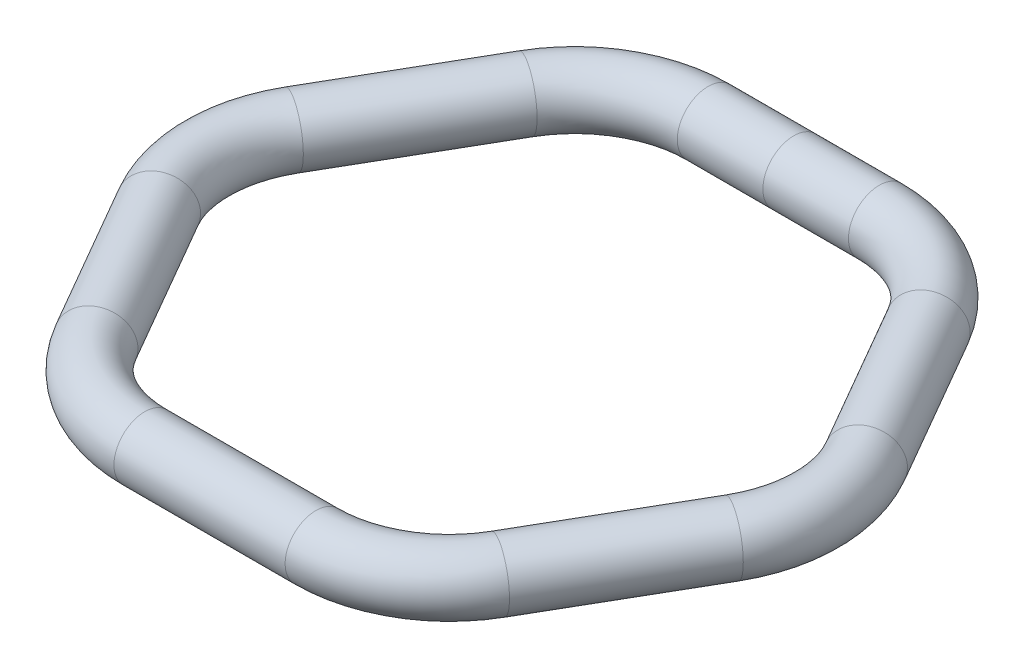
ISO-10303-21;
HEADER;
FILE_DESCRIPTION(('STEP AP214'),'2;1');
FILE_NAME('part.step','',(''),(''),'','','');
FILE_SCHEMA(('AUTOMOTIVE_DESIGN { 1 0 10303 214 1 1 1 1 }'));
ENDSEC;
DATA;
#1=APPLICATION_CONTEXT('core data for automotive mechanical design processes');
#2=APPLICATION_PROTOCOL_DEFINITION('international standard','automotive_design',2000,#1);
#3=PRODUCT_CONTEXT('',#1,'mechanical');
#4=PRODUCT('Part','Part','',(#3));
#5=PRODUCT_RELATED_PRODUCT_CATEGORY('part','',(#4));
#6=PRODUCT_DEFINITION_FORMATION('','',#4);
#7=PRODUCT_DEFINITION_CONTEXT('part definition',#1,'design');
#8=PRODUCT_DEFINITION('design','',#6,#7);
#9=PRODUCT_DEFINITION_SHAPE('','',#8);
#10=(LENGTH_UNIT() NAMED_UNIT(*) SI_UNIT(.MILLI.,.METRE.));
#11=(NAMED_UNIT(*) PLANE_ANGLE_UNIT() SI_UNIT($,.RADIAN.));
#12=(NAMED_UNIT(*) SI_UNIT($,.STERADIAN.) SOLID_ANGLE_UNIT());
#13=UNCERTAINTY_MEASURE_WITH_UNIT(LENGTH_MEASURE(1.E-05),#10,'distance_accuracy_value','');
#14=(GEOMETRIC_REPRESENTATION_CONTEXT(3) GLOBAL_UNCERTAINTY_ASSIGNED_CONTEXT((#13)) GLOBAL_UNIT_ASSIGNED_CONTEXT((#10,
#11,#12)) REPRESENTATION_CONTEXT('',''));
#15=CARTESIAN_POINT('',(0.,0.,0.));
#16=DIRECTION('',(0.,0.,1.));
#17=DIRECTION('',(1.,0.,0.));
#18=AXIS2_PLACEMENT_3D('',#15,#16,#17);
#19=CARTESIAN_POINT('',(-20.8423447177455,0.,-68.6));
#20=DIRECTION('',(1.,0.,0.));
#21=DIRECTION('',(0.,0.,-1.));
#22=AXIS2_PLACEMENT_3D('',#19,#20,#21);
#23=CYLINDRICAL_SURFACE('',#22,7.50000000000001);
#24=CARTESIAN_POINT('',(0.,0.,-68.6));
#25=DIRECTION('',(1.,0.,0.));
#26=DIRECTION('',(0.,0.,-1.));
#27=AXIS2_PLACEMENT_3D('',#24,#25,#26);
#28=CIRCLE('',#27,7.50000000000001);
#29=CARTESIAN_POINT('',(0.,0.,-76.1));
#30=VERTEX_POINT('',#29);
#31=EDGE_CURVE('E73',#30,#30,#28,.T.);
#32=ORIENTED_EDGE('',*,*,#31,.F.);
#33=EDGE_LOOP('',(#32));
#34=FACE_BOUND('',#33,.T.);
#35=CARTESIAN_POINT('',(-20.8423447177455,0.,-68.6));
#36=DIRECTION('',(1.,0.,0.));
#37=DIRECTION('',(0.,0.,-1.));
#38=AXIS2_PLACEMENT_3D('',#35,#36,#37);
#39=CIRCLE('',#38,7.50000000000001);
#40=CARTESIAN_POINT('',(-20.8423447177455,0.,-76.1));
#41=VERTEX_POINT('',#40);
#42=EDGE_CURVE('E10',#41,#41,#39,.T.);
#43=ORIENTED_EDGE('',*,*,#42,.T.);
#44=EDGE_LOOP('',(#43));
#45=FACE_BOUND('',#44,.T.);
#46=ADVANCED_FACE('F30',(#34,#45),#23,.T.);
#47=CARTESIAN_POINT('',(-20.8423447177455,0.,-36.1));
#48=DIRECTION('',(0.,-1.,0.));
#49=DIRECTION('',(0.,0.,-1.));
#50=AXIS2_PLACEMENT_3D('',#47,#48,#49);
#51=TOROIDAL_SURFACE('',#50,32.5,7.50000000000001);
#52=CARTESIAN_POINT('',(-48.9881703407398,0.,-52.35));
#53=DIRECTION('',(0.5,0.,-0.866025403784439));
#54=DIRECTION('',(-0.866025403784439,0.,-0.5));
#55=AXIS2_PLACEMENT_3D('',#52,#53,#54);
#56=CIRCLE('',#55,7.50000000000001);
#57=CARTESIAN_POINT('',(-55.4833608691231,0.,-56.1));
#58=VERTEX_POINT('',#57);
#59=EDGE_CURVE('E36',#58,#58,#56,.T.);
#60=CARTESIAN_POINT('',(-20.8423447177455,0.,-36.1));
#61=DIRECTION('',(0.,-1.,0.));
#62=DIRECTION('',(0.,0.,-1.));
#63=AXIS2_PLACEMENT_3D('',#60,#61,#62);
#64=CIRCLE('',#63,40.);
#65=EDGE_CURVE('',#58,#41,#64,.T.);
#66=ORIENTED_EDGE('',*,*,#59,.T.);
#67=ORIENTED_EDGE('',*,*,#42,.F.);
#68=ORIENTED_EDGE('',*,*,#65,.T.);
#69=ORIENTED_EDGE('',*,*,#65,.F.);
#70=EDGE_LOOP('',(#66,#68,#67,#69));
#71=FACE_BOUND('',#70,.T.);
#72=ADVANCED_FACE('F80',(#71),#51,.T.);
#73=CARTESIAN_POINT('',(-69.8305150584852,0.,-16.25));
#74=DIRECTION('',(0.5,0.,-0.866025403784439));
#75=DIRECTION('',(-0.866025403784439,0.,-0.5));
#76=AXIS2_PLACEMENT_3D('',#73,#74,#75);
#77=CYLINDRICAL_SURFACE('',#76,7.50000000000001);
#78=ORIENTED_EDGE('',*,*,#59,.F.);
#79=EDGE_LOOP('',(#78));
#80=FACE_BOUND('',#79,.T.);
#81=CARTESIAN_POINT('',(-69.8305150584852,0.,-16.25));
#82=DIRECTION('',(0.499999999999999,0.,-0.866025403784439));
#83=DIRECTION('',(-0.866025403784439,0.,-0.499999999999999));
#84=AXIS2_PLACEMENT_3D('',#81,#82,#83);
#85=CIRCLE('',#84,7.50000000000001);
#86=CARTESIAN_POINT('',(-76.3257055868686,0.,-20.));
#87=VERTEX_POINT('',#86);
#88=EDGE_CURVE('E40',#87,#87,#85,.T.);
#89=ORIENTED_EDGE('',*,*,#88,.T.);
#90=EDGE_LOOP('',(#89));
#91=FACE_BOUND('',#90,.T.);
#92=ADVANCED_FACE('F84',(#80,#91),#77,.T.);
#93=CARTESIAN_POINT('',(-41.684689435491,0.,0.));
#94=DIRECTION('',(0.,-1.,0.));
#95=DIRECTION('',(0.,0.,-1.));
#96=AXIS2_PLACEMENT_3D('',#93,#94,#95);
#97=TOROIDAL_SURFACE('',#96,32.5,7.50000000000001);
#98=CARTESIAN_POINT('',(-69.8305150584852,0.,16.25));
#99=DIRECTION('',(-0.5,0.,-0.866025403784439));
#100=DIRECTION('',(-0.866025403784439,0.,0.5));
#101=AXIS2_PLACEMENT_3D('',#98,#99,#100);
#102=CIRCLE('',#101,7.50000000000001);
#103=CARTESIAN_POINT('',(-76.3257055868686,0.,20.));
#104=VERTEX_POINT('',#103);
#105=EDGE_CURVE('E44',#104,#104,#102,.T.);
#106=CARTESIAN_POINT('',(-41.684689435491,0.,0.));
#107=DIRECTION('',(0.,-1.,0.));
#108=DIRECTION('',(0.,0.,-1.));
#109=AXIS2_PLACEMENT_3D('',#106,#107,#108);
#110=CIRCLE('',#109,40.);
#111=EDGE_CURVE('',#104,#87,#110,.T.);
#112=ORIENTED_EDGE('',*,*,#105,.T.);
#113=ORIENTED_EDGE('',*,*,#88,.F.);
#114=ORIENTED_EDGE('',*,*,#111,.T.);
#115=ORIENTED_EDGE('',*,*,#111,.F.);
#116=EDGE_LOOP('',(#112,#114,#113,#115));
#117=FACE_BOUND('',#116,.T.);
#118=ADVANCED_FACE('F89',(#117),#97,.T.);
#119=CARTESIAN_POINT('',(-48.9881703407397,0.,52.35));
#120=DIRECTION('',(-0.5,0.,-0.866025403784439));
#121=DIRECTION('',(-0.866025403784439,0.,0.5));
#122=AXIS2_PLACEMENT_3D('',#119,#120,#121);
#123=CYLINDRICAL_SURFACE('',#122,7.50000000000001);
#124=ORIENTED_EDGE('',*,*,#105,.F.);
#125=EDGE_LOOP('',(#124));
#126=FACE_BOUND('',#125,.T.);
#127=CARTESIAN_POINT('',(-48.9881703407397,0.,52.35));
#128=DIRECTION('',(-0.5,0.,-0.866025403784438));
#129=DIRECTION('',(-0.866025403784438,0.,0.5));
#130=AXIS2_PLACEMENT_3D('',#127,#128,#129);
#131=CIRCLE('',#130,7.50000000000001);
#132=CARTESIAN_POINT('',(-55.483360869123,0.,56.1));
#133=VERTEX_POINT('',#132);
#134=EDGE_CURVE('E49',#133,#133,#131,.T.);
#135=ORIENTED_EDGE('',*,*,#134,.T.);
#136=EDGE_LOOP('',(#135));
#137=FACE_BOUND('',#136,.T.);
#138=ADVANCED_FACE('F95',(#126,#137),#123,.T.);
#139=CARTESIAN_POINT('',(-20.8423447177455,0.,36.1));
#140=DIRECTION('',(0.,-1.,0.));
#141=DIRECTION('',(0.,0.,-1.));
#142=AXIS2_PLACEMENT_3D('',#139,#140,#141);
#143=TOROIDAL_SURFACE('',#142,32.5,7.50000000000001);
#144=CARTESIAN_POINT('',(-20.8423447177455,0.,68.6));
#145=DIRECTION('',(-1.,0.,0.));
#146=DIRECTION('',(0.,0.,1.));
#147=AXIS2_PLACEMENT_3D('',#144,#145,#146);
#148=CIRCLE('',#147,7.50000000000001);
#149=CARTESIAN_POINT('',(-20.8423447177455,0.,76.1));
#150=VERTEX_POINT('',#149);
#151=EDGE_CURVE('E52',#150,#150,#148,.T.);
#152=CARTESIAN_POINT('',(-20.8423447177455,0.,36.1));
#153=DIRECTION('',(0.,-1.,0.));
#154=DIRECTION('',(0.,0.,-1.));
#155=AXIS2_PLACEMENT_3D('',#152,#153,#154);
#156=CIRCLE('',#155,40.);
#157=EDGE_CURVE('',#150,#133,#156,.T.);
#158=ORIENTED_EDGE('',*,*,#151,.T.);
#159=ORIENTED_EDGE('',*,*,#134,.F.);
#160=ORIENTED_EDGE('',*,*,#157,.T.);
#161=ORIENTED_EDGE('',*,*,#157,.F.);
#162=EDGE_LOOP('',(#158,#160,#159,#161));
#163=FACE_BOUND('',#162,.T.);
#164=ADVANCED_FACE('F99',(#163),#143,.T.);
#165=CARTESIAN_POINT('',(20.8423447177455,0.,68.6));
#166=DIRECTION('',(-1.,0.,0.));
#167=DIRECTION('',(0.,0.,1.));
#168=AXIS2_PLACEMENT_3D('',#165,#166,#167);
#169=CYLINDRICAL_SURFACE('',#168,7.50000000000001);
#170=ORIENTED_EDGE('',*,*,#151,.F.);
#171=EDGE_LOOP('',(#170));
#172=FACE_BOUND('',#171,.T.);
#173=CARTESIAN_POINT('',(20.8423447177455,0.,68.6));
#174=DIRECTION('',(-1.,0.,0.));
#175=DIRECTION('',(0.,0.,1.));
#176=AXIS2_PLACEMENT_3D('',#173,#174,#175);
#177=CIRCLE('',#176,7.50000000000001);
#178=CARTESIAN_POINT('',(20.8423447177455,0.,76.1));
#179=VERTEX_POINT('',#178);
#180=EDGE_CURVE('E55',#179,#179,#177,.T.);
#181=ORIENTED_EDGE('',*,*,#180,.T.);
#182=EDGE_LOOP('',(#181));
#183=FACE_BOUND('',#182,.T.);
#184=ADVANCED_FACE('F103',(#172,#183),#169,.T.);
#185=CARTESIAN_POINT('',(20.8423447177455,0.,36.1));
#186=DIRECTION('',(0.,-1.,0.));
#187=DIRECTION('',(0.,0.,-1.));
#188=AXIS2_PLACEMENT_3D('',#185,#186,#187);
#189=TOROIDAL_SURFACE('',#188,32.5,7.50000000000001);
#190=CARTESIAN_POINT('',(48.9881703407397,0.,52.35));
#191=DIRECTION('',(-0.5,0.,0.866025403784439));
#192=DIRECTION('',(0.866025403784439,0.,0.5));
#193=AXIS2_PLACEMENT_3D('',#190,#191,#192);
#194=CIRCLE('',#193,7.50000000000001);
#195=CARTESIAN_POINT('',(55.4833608691231,0.,56.1));
#196=VERTEX_POINT('',#195);
#197=EDGE_CURVE('E58',#196,#196,#194,.T.);
#198=CARTESIAN_POINT('',(20.8423447177455,0.,36.1));
#199=DIRECTION('',(0.,-1.,0.));
#200=DIRECTION('',(0.,0.,-1.));
#201=AXIS2_PLACEMENT_3D('',#198,#199,#200);
#202=CIRCLE('',#201,40.);
#203=EDGE_CURVE('',#196,#179,#202,.T.);
#204=ORIENTED_EDGE('',*,*,#197,.T.);
#205=ORIENTED_EDGE('',*,*,#180,.F.);
#206=ORIENTED_EDGE('',*,*,#203,.T.);
#207=ORIENTED_EDGE('',*,*,#203,.F.);
#208=EDGE_LOOP('',(#204,#206,#205,#207));
#209=FACE_BOUND('',#208,.T.);
#210=ADVANCED_FACE('F107',(#209),#189,.T.);
#211=CARTESIAN_POINT('',(69.8305150584852,0.,16.25));
#212=DIRECTION('',(-0.5,0.,0.866025403784439));
#213=DIRECTION('',(0.866025403784439,0.,0.5));
#214=AXIS2_PLACEMENT_3D('',#211,#212,#213);
#215=CYLINDRICAL_SURFACE('',#214,7.50000000000001);
#216=ORIENTED_EDGE('',*,*,#197,.F.);
#217=EDGE_LOOP('',(#216));
#218=FACE_BOUND('',#217,.T.);
#219=CARTESIAN_POINT('',(69.8305150584852,0.,16.25));
#220=DIRECTION('',(-0.499999999999999,0.,0.866025403784439));
#221=DIRECTION('',(0.866025403784439,0.,0.499999999999999));
#222=AXIS2_PLACEMENT_3D('',#219,#220,#221);
#223=CIRCLE('',#222,7.50000000000001);
#224=CARTESIAN_POINT('',(76.3257055868686,0.,20.));
#225=VERTEX_POINT('',#224);
#226=EDGE_CURVE('E61',#225,#225,#223,.T.);
#227=ORIENTED_EDGE('',*,*,#226,.T.);
#228=EDGE_LOOP('',(#227));
#229=FACE_BOUND('',#228,.T.);
#230=ADVANCED_FACE('F111',(#218,#229),#215,.T.);
#231=CARTESIAN_POINT('',(41.684689435491,0.,0.));
#232=DIRECTION('',(0.,-1.,0.));
#233=DIRECTION('',(0.,0.,-1.));
#234=AXIS2_PLACEMENT_3D('',#231,#232,#233);
#235=TOROIDAL_SURFACE('',#234,32.5,7.50000000000001);
#236=CARTESIAN_POINT('',(69.8305150584852,0.,-16.25));
#237=DIRECTION('',(0.500000000000001,0.,0.866025403784438));
#238=DIRECTION('',(0.866025403784438,0.,-0.500000000000001));
#239=AXIS2_PLACEMENT_3D('',#236,#237,#238);
#240=CIRCLE('',#239,7.50000000000001);
#241=CARTESIAN_POINT('',(76.3257055868685,0.,-20.));
#242=VERTEX_POINT('',#241);
#243=EDGE_CURVE('E64',#242,#242,#240,.T.);
#244=CARTESIAN_POINT('',(41.684689435491,0.,0.));
#245=DIRECTION('',(0.,-1.,0.));
#246=DIRECTION('',(0.,0.,-1.));
#247=AXIS2_PLACEMENT_3D('',#244,#245,#246);
#248=CIRCLE('',#247,40.);
#249=EDGE_CURVE('',#242,#225,#248,.T.);
#250=ORIENTED_EDGE('',*,*,#243,.T.);
#251=ORIENTED_EDGE('',*,*,#226,.F.);
#252=ORIENTED_EDGE('',*,*,#249,.T.);
#253=ORIENTED_EDGE('',*,*,#249,.F.);
#254=EDGE_LOOP('',(#250,#252,#251,#253));
#255=FACE_BOUND('',#254,.T.);
#256=ADVANCED_FACE('F115',(#255),#235,.T.);
#257=CARTESIAN_POINT('',(48.9881703407397,0.,-52.35));
#258=DIRECTION('',(0.5,0.,0.866025403784438));
#259=DIRECTION('',(0.866025403784438,0.,-0.5));
#260=AXIS2_PLACEMENT_3D('',#257,#258,#259);
#261=CYLINDRICAL_SURFACE('',#260,7.50000000000001);
#262=ORIENTED_EDGE('',*,*,#243,.F.);
#263=EDGE_LOOP('',(#262));
#264=FACE_BOUND('',#263,.T.);
#265=CARTESIAN_POINT('',(48.9881703407397,0.,-52.35));
#266=DIRECTION('',(0.500000000000001,0.,0.866025403784438));
#267=DIRECTION('',(0.866025403784438,0.,-0.500000000000001));
#268=AXIS2_PLACEMENT_3D('',#265,#266,#267);
#269=CIRCLE('',#268,7.50000000000001);
#270=CARTESIAN_POINT('',(55.483360869123,0.,-56.1000000000001));
#271=VERTEX_POINT('',#270);
#272=EDGE_CURVE('E67',#271,#271,#269,.T.);
#273=ORIENTED_EDGE('',*,*,#272,.T.);
#274=EDGE_LOOP('',(#273));
#275=FACE_BOUND('',#274,.T.);
#276=ADVANCED_FACE('F119',(#264,#275),#261,.T.);
#277=CARTESIAN_POINT('',(20.8423447177455,0.,-36.1));
#278=DIRECTION('',(0.,-1.,0.));
#279=DIRECTION('',(0.,0.,-1.));
#280=AXIS2_PLACEMENT_3D('',#277,#278,#279);
#281=TOROIDAL_SURFACE('',#280,32.5,7.50000000000001);
#282=CARTESIAN_POINT('',(20.8423447177455,0.,-68.6));
#283=DIRECTION('',(1.,0.,0.));
#284=DIRECTION('',(0.,0.,-1.));
#285=AXIS2_PLACEMENT_3D('',#282,#283,#284);
#286=CIRCLE('',#285,7.50000000000001);
#287=CARTESIAN_POINT('',(20.8423447177455,0.,-76.1));
#288=VERTEX_POINT('',#287);
#289=EDGE_CURVE('E70',#288,#288,#286,.T.);
#290=CARTESIAN_POINT('',(20.8423447177455,0.,-36.1));
#291=DIRECTION('',(0.,-1.,0.));
#292=DIRECTION('',(0.,0.,-1.));
#293=AXIS2_PLACEMENT_3D('',#290,#291,#292);
#294=CIRCLE('',#293,40.);
#295=EDGE_CURVE('',#288,#271,#294,.T.);
#296=ORIENTED_EDGE('',*,*,#289,.T.);
#297=ORIENTED_EDGE('',*,*,#272,.F.);
#298=ORIENTED_EDGE('',*,*,#295,.T.);
#299=ORIENTED_EDGE('',*,*,#295,.F.);
#300=EDGE_LOOP('',(#296,#298,#297,#299));
#301=FACE_BOUND('',#300,.T.);
#302=ADVANCED_FACE('F123',(#301),#281,.T.);
#303=CARTESIAN_POINT('',(0.,0.,-68.6));
#304=DIRECTION('',(1.,0.,0.));
#305=DIRECTION('',(0.,0.,-1.));
#306=AXIS2_PLACEMENT_3D('',#303,#304,#305);
#307=CYLINDRICAL_SURFACE('',#306,7.50000000000001);
#308=ORIENTED_EDGE('',*,*,#289,.F.);
#309=EDGE_LOOP('',(#308));
#310=FACE_BOUND('',#309,.T.);
#311=ORIENTED_EDGE('',*,*,#31,.T.);
#312=EDGE_LOOP('',(#311));
#313=FACE_BOUND('',#312,.T.);
#314=ADVANCED_FACE('F77',(#310,#313),#307,.T.);
#315=CLOSED_SHELL('',(#46,#72,#92,#118,#138,#164,#184,#210,#230,#256,#276,#302,#314));
#316=MANIFOLD_SOLID_BREP('B2',#315);
#317=ADVANCED_BREP_SHAPE_REPRESENTATION('',(#18,#316),#14);
#318=SHAPE_DEFINITION_REPRESENTATION(#9,#317);
ENDSEC;
END-ISO-10303-21;
